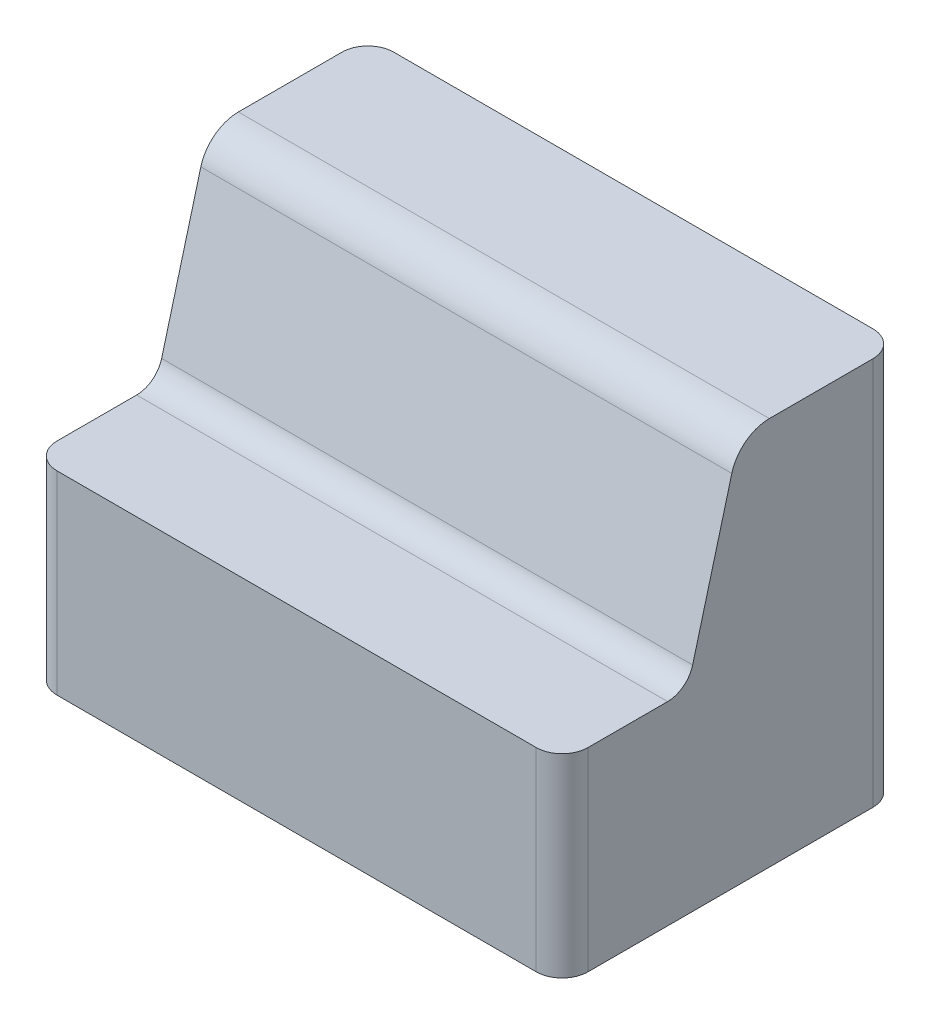
ISO-10303-21;
HEADER;
FILE_DESCRIPTION(('STEP AP214'),'2;1');
FILE_NAME('part.step','',(''),(''),'','','');
FILE_SCHEMA(('AUTOMOTIVE_DESIGN { 1 0 10303 214 1 1 1 1 }'));
ENDSEC;
DATA;
#1=APPLICATION_CONTEXT('core data for automotive mechanical design processes');
#2=APPLICATION_PROTOCOL_DEFINITION('international standard','automotive_design',2000,#1);
#3=PRODUCT_CONTEXT('',#1,'mechanical');
#4=PRODUCT('Part','Part','',(#3));
#5=PRODUCT_RELATED_PRODUCT_CATEGORY('part','',(#4));
#6=PRODUCT_DEFINITION_FORMATION('','',#4);
#7=PRODUCT_DEFINITION_CONTEXT('part definition',#1,'design');
#8=PRODUCT_DEFINITION('design','',#6,#7);
#9=PRODUCT_DEFINITION_SHAPE('','',#8);
#10=(LENGTH_UNIT() NAMED_UNIT(*) SI_UNIT(.MILLI.,.METRE.));
#11=(NAMED_UNIT(*) PLANE_ANGLE_UNIT() SI_UNIT($,.RADIAN.));
#12=(NAMED_UNIT(*) SI_UNIT($,.STERADIAN.) SOLID_ANGLE_UNIT());
#13=UNCERTAINTY_MEASURE_WITH_UNIT(LENGTH_MEASURE(1.E-05),#10,'distance_accuracy_value','');
#14=(GEOMETRIC_REPRESENTATION_CONTEXT(3) GLOBAL_UNCERTAINTY_ASSIGNED_CONTEXT((#13)) GLOBAL_UNIT_ASSIGNED_CONTEXT((#10,
#11,#12)) REPRESENTATION_CONTEXT('',''));
#15=CARTESIAN_POINT('',(0.,0.,0.));
#16=DIRECTION('',(0.,0.,1.));
#17=DIRECTION('',(1.,0.,0.));
#18=AXIS2_PLACEMENT_3D('',#15,#16,#17);
#19=CARTESIAN_POINT('',(20.5,-3.,10.));
#20=DIRECTION('',(-1.,0.,0.));
#21=DIRECTION('',(0.,0.,1.));
#22=AXIS2_PLACEMENT_3D('',#19,#20,#21);
#23=CYLINDRICAL_SURFACE('',#22,3.);
#24=CARTESIAN_POINT('',(-20.5,-3.,10.));
#25=DIRECTION('',(1.,0.,0.));
#26=DIRECTION('',(0.,0.,1.));
#27=AXIS2_PLACEMENT_3D('',#24,#25,#26);
#28=CIRCLE('',#27,3.);
#29=CARTESIAN_POINT('',(-20.5,0.,10.));
#30=VERTEX_POINT('',#29);
#31=CARTESIAN_POINT('',(-20.5,-2.22354286469243,12.8977774788672));
#32=VERTEX_POINT('',#31);
#33=EDGE_CURVE('E168',#30,#32,#28,.T.);
#34=ORIENTED_EDGE('',*,*,#33,.T.);
#35=DIRECTION('',(-1.,0.,0.));
#36=VECTOR('',#35,1.);
#37=CARTESIAN_POINT('',(20.5,-2.22354286469243,12.8977774788672));
#38=LINE('',#37,#36);
#39=CARTESIAN_POINT('',(20.5,-2.22354286469243,12.8977774788672));
#40=VERTEX_POINT('',#39);
#41=EDGE_CURVE('E207',#40,#32,#38,.T.);
#42=ORIENTED_EDGE('',*,*,#41,.F.);
#43=CARTESIAN_POINT('',(20.5,-3.,10.));
#44=DIRECTION('',(1.,0.,0.));
#45=DIRECTION('',(0.,0.,1.));
#46=AXIS2_PLACEMENT_3D('',#43,#44,#45);
#47=CIRCLE('',#46,3.);
#48=CARTESIAN_POINT('',(20.5,0.,10.));
#49=VERTEX_POINT('',#48);
#50=EDGE_CURVE('E169',#49,#40,#47,.T.);
#51=ORIENTED_EDGE('',*,*,#50,.F.);
#52=DIRECTION('',(-1.,0.,0.));
#53=VECTOR('',#52,1.);
#54=CARTESIAN_POINT('',(20.5,0.,10.));
#55=LINE('',#54,#53);
#56=EDGE_CURVE('E182',#49,#30,#55,.T.);
#57=ORIENTED_EDGE('',*,*,#56,.T.);
#58=EDGE_LOOP('',(#34,#42,#51,#57));
#59=FACE_BOUND('',#58,.T.);
#60=ADVANCED_FACE('F51',(#59),#23,.T.);
#61=CARTESIAN_POINT('',(20.5,-15.,16.3212188504038));
#62=DIRECTION('',(0.,-0.258819045102525,-0.965925826289067));
#63=DIRECTION('',(0.,0.965925826289067,-0.258819045102525));
#64=AXIS2_PLACEMENT_3D('',#61,#62,#63);
#65=PLANE('',#64);
#66=DIRECTION('',(0.,-0.965925826289067,0.258819045102525));
#67=VECTOR('',#66,1.);
#68=CARTESIAN_POINT('',(-20.5,-15.,16.3212188504038));
#69=LINE('',#68,#67);
#70=CARTESIAN_POINT('',(-20.5,-13.5176380902051,15.9240211737836));
#71=VERTEX_POINT('',#70);
#72=EDGE_CURVE('E185',#32,#71,#69,.T.);
#73=ORIENTED_EDGE('',*,*,#72,.T.);
#74=DIRECTION('',(-1.,0.,0.));
#75=VECTOR('',#74,1.);
#76=CARTESIAN_POINT('',(20.5,-13.5176380902051,15.9240211737836));
#77=LINE('',#76,#75);
#78=CARTESIAN_POINT('',(20.5,-13.5176380902051,15.9240211737836));
#79=VERTEX_POINT('',#78);
#80=EDGE_CURVE('E66',#71,#79,#77,.F.);
#81=ORIENTED_EDGE('',*,*,#80,.T.);
#82=DIRECTION('',(0.,-0.965925826289067,0.258819045102525));
#83=VECTOR('',#82,1.);
#84=CARTESIAN_POINT('',(20.5,-15.,16.3212188504038));
#85=LINE('',#84,#83);
#86=EDGE_CURVE('E172',#40,#79,#85,.T.);
#87=ORIENTED_EDGE('',*,*,#86,.F.);
#88=ORIENTED_EDGE('',*,*,#41,.T.);
#89=EDGE_LOOP('',(#73,#81,#87,#88));
#90=FACE_BOUND('',#89,.T.);
#91=ADVANCED_FACE('F303',(#90),#65,.F.);
#92=CARTESIAN_POINT('',(20.5,-15.,26.));
#93=DIRECTION('',(0.,-1.,0.));
#94=DIRECTION('',(0.,0.,-1.));
#95=AXIS2_PLACEMENT_3D('',#92,#93,#94);
#96=PLANE('',#95);
#97=DIRECTION('',(0.,0.,1.));
#98=VECTOR('',#97,1.);
#99=CARTESIAN_POINT('',(20.5,-15.,26.));
#100=LINE('',#99,#98);
#101=CARTESIAN_POINT('',(20.5,-15.,17.8558728263617));
#102=VERTEX_POINT('',#101);
#103=CARTESIAN_POINT('',(20.5,-15.,24.));
#104=VERTEX_POINT('',#103);
#105=EDGE_CURVE('E175',#102,#104,#100,.T.);
#106=ORIENTED_EDGE('',*,*,#105,.F.);
#107=DIRECTION('',(-1.,0.,0.));
#108=VECTOR('',#107,1.);
#109=CARTESIAN_POINT('',(-20.5,-15.,17.8558728263617));
#110=LINE('',#109,#108);
#111=CARTESIAN_POINT('',(-20.5,-15.,17.8558728263617));
#112=VERTEX_POINT('',#111);
#113=EDGE_CURVE('E248',#102,#112,#110,.T.);
#114=ORIENTED_EDGE('',*,*,#113,.T.);
#115=DIRECTION('',(0.,0.,1.));
#116=VECTOR('',#115,1.);
#117=CARTESIAN_POINT('',(-20.5,-15.,26.));
#118=LINE('',#117,#116);
#119=CARTESIAN_POINT('',(-20.5,-15.,24.));
#120=VERTEX_POINT('',#119);
#121=EDGE_CURVE('E187',#112,#120,#118,.T.);
#122=ORIENTED_EDGE('',*,*,#121,.T.);
#123=CARTESIAN_POINT('',(-18.5,-15.,24.));
#124=DIRECTION('',(0.,-1.,0.));
#125=DIRECTION('',(0.,0.,-1.));
#126=AXIS2_PLACEMENT_3D('',#123,#124,#125);
#127=CIRCLE('',#126,2.);
#128=CARTESIAN_POINT('',(-18.5,-15.,26.));
#129=VERTEX_POINT('',#128);
#130=EDGE_CURVE('E240',#120,#129,#127,.F.);
#131=ORIENTED_EDGE('',*,*,#130,.T.);
#132=DIRECTION('',(-1.,0.,0.));
#133=VECTOR('',#132,1.);
#134=CARTESIAN_POINT('',(20.5,-15.,26.));
#135=LINE('',#134,#133);
#136=CARTESIAN_POINT('',(18.5,-15.,26.));
#137=VERTEX_POINT('',#136);
#138=EDGE_CURVE('E204',#137,#129,#135,.T.);
#139=ORIENTED_EDGE('',*,*,#138,.F.);
#140=CARTESIAN_POINT('',(18.5,-15.,24.));
#141=DIRECTION('',(0.,-1.,0.));
#142=DIRECTION('',(0.,0.,-1.));
#143=AXIS2_PLACEMENT_3D('',#140,#141,#142);
#144=CIRCLE('',#143,2.);
#145=EDGE_CURVE('E237',#137,#104,#144,.F.);
#146=ORIENTED_EDGE('',*,*,#145,.T.);
#147=EDGE_LOOP('',(#106,#114,#122,#131,#139,#146));
#148=FACE_BOUND('',#147,.T.);
#149=ADVANCED_FACE('F254',(#148),#96,.F.);
#150=CARTESIAN_POINT('',(20.5,-30.,26.));
#151=DIRECTION('',(0.,0.,-1.));
#152=DIRECTION('',(-1.,0.,0.));
#153=AXIS2_PLACEMENT_3D('',#150,#151,#152);
#154=PLANE('',#153);
#155=ORIENTED_EDGE('',*,*,#138,.T.);
#156=DIRECTION('',(0.,-1.,0.));
#157=VECTOR('',#156,1.);
#158=CARTESIAN_POINT('',(-18.5,-30.,26.));
#159=LINE('',#158,#157);
#160=CARTESIAN_POINT('',(-18.5,-30.,26.));
#161=VERTEX_POINT('',#160);
#162=EDGE_CURVE('E234',#129,#161,#159,.T.);
#163=ORIENTED_EDGE('',*,*,#162,.T.);
#164=DIRECTION('',(-1.,0.,0.));
#165=VECTOR('',#164,1.);
#166=CARTESIAN_POINT('',(20.5,-30.,26.));
#167=LINE('',#166,#165);
#168=CARTESIAN_POINT('',(18.5,-30.,26.));
#169=VERTEX_POINT('',#168);
#170=EDGE_CURVE('E201',#169,#161,#167,.T.);
#171=ORIENTED_EDGE('',*,*,#170,.F.);
#172=DIRECTION('',(0.,-1.,0.));
#173=VECTOR('',#172,1.);
#174=CARTESIAN_POINT('',(18.5,-30.,26.));
#175=LINE('',#174,#173);
#176=EDGE_CURVE('E232',#169,#137,#175,.F.);
#177=ORIENTED_EDGE('',*,*,#176,.T.);
#178=EDGE_LOOP('',(#155,#163,#171,#177));
#179=FACE_BOUND('',#178,.T.);
#180=ADVANCED_FACE('F268',(#179),#154,.F.);
#181=CARTESIAN_POINT('',(20.5,-30.,0.));
#182=DIRECTION('',(0.,1.,0.));
#183=DIRECTION('',(0.,0.,1.));
#184=AXIS2_PLACEMENT_3D('',#181,#182,#183);
#185=PLANE('',#184);
#186=CARTESIAN_POINT('',(13.,-30.,7.5));
#187=DIRECTION('',(0.,-1.,0.));
#188=DIRECTION('',(0.,0.,-1.));
#189=AXIS2_PLACEMENT_3D('',#186,#187,#188);
#190=CIRCLE('',#189,3.025);
#191=CARTESIAN_POINT('',(13.,-30.,4.475));
#192=VERTEX_POINT('',#191);
#193=EDGE_CURVE('E159',#192,#192,#190,.T.);
#194=ORIENTED_EDGE('',*,*,#193,.F.);
#195=EDGE_LOOP('',(#194));
#196=FACE_BOUND('',#195,.T.);
#197=CARTESIAN_POINT('',(-13.,-30.,7.5));
#198=DIRECTION('',(0.,-1.,0.));
#199=DIRECTION('',(0.,0.,-1.));
#200=AXIS2_PLACEMENT_3D('',#197,#198,#199);
#201=CIRCLE('',#200,3.025);
#202=CARTESIAN_POINT('',(-13.,-30.,4.475));
#203=VERTEX_POINT('',#202);
#204=EDGE_CURVE('E152',#203,#203,#201,.T.);
#205=ORIENTED_EDGE('',*,*,#204,.F.);
#206=EDGE_LOOP('',(#205));
#207=FACE_BOUND('',#206,.T.);
#208=DIRECTION('',(0.,0.,-1.));
#209=VECTOR('',#208,1.);
#210=CARTESIAN_POINT('',(-20.5,-30.,0.));
#211=LINE('',#210,#209);
#212=CARTESIAN_POINT('',(-20.5,-30.,24.));
#213=VERTEX_POINT('',#212);
#214=CARTESIAN_POINT('',(-20.5,-30.,2.));
#215=VERTEX_POINT('',#214);
#216=EDGE_CURVE('E189',#213,#215,#211,.T.);
#217=ORIENTED_EDGE('',*,*,#216,.T.);
#218=CARTESIAN_POINT('',(-18.5,-30.,2.));
#219=DIRECTION('',(0.,1.,0.));
#220=DIRECTION('',(0.,0.,1.));
#221=AXIS2_PLACEMENT_3D('',#218,#219,#220);
#222=CIRCLE('',#221,2.);
#223=CARTESIAN_POINT('',(-18.5,-30.,0.));
#224=VERTEX_POINT('',#223);
#225=EDGE_CURVE('E230',#215,#224,#222,.F.);
#226=ORIENTED_EDGE('',*,*,#225,.T.);
#227=DIRECTION('',(-1.,0.,0.));
#228=VECTOR('',#227,1.);
#229=CARTESIAN_POINT('',(20.5,-30.,0.));
#230=LINE('',#229,#228);
#231=CARTESIAN_POINT('',(18.5,-30.,0.));
#232=VERTEX_POINT('',#231);
#233=EDGE_CURVE('E198',#232,#224,#230,.T.);
#234=ORIENTED_EDGE('',*,*,#233,.F.);
#235=CARTESIAN_POINT('',(18.5,-30.,2.));
#236=DIRECTION('',(0.,1.,0.));
#237=DIRECTION('',(0.,0.,1.));
#238=AXIS2_PLACEMENT_3D('',#235,#236,#237);
#239=CIRCLE('',#238,2.);
#240=CARTESIAN_POINT('',(20.5,-30.,2.));
#241=VERTEX_POINT('',#240);
#242=EDGE_CURVE('E226',#232,#241,#239,.F.);
#243=ORIENTED_EDGE('',*,*,#242,.T.);
#244=DIRECTION('',(0.,0.,-1.));
#245=VECTOR('',#244,1.);
#246=CARTESIAN_POINT('',(20.5,-30.,0.));
#247=LINE('',#246,#245);
#248=CARTESIAN_POINT('',(20.5,-30.,24.));
#249=VERTEX_POINT('',#248);
#250=EDGE_CURVE('E177',#249,#241,#247,.T.);
#251=ORIENTED_EDGE('',*,*,#250,.F.);
#252=CARTESIAN_POINT('',(18.5,-30.,24.));
#253=DIRECTION('',(0.,1.,0.));
#254=DIRECTION('',(0.,0.,1.));
#255=AXIS2_PLACEMENT_3D('',#252,#253,#254);
#256=CIRCLE('',#255,2.);
#257=EDGE_CURVE('E224',#249,#169,#256,.F.);
#258=ORIENTED_EDGE('',*,*,#257,.T.);
#259=ORIENTED_EDGE('',*,*,#170,.T.);
#260=CARTESIAN_POINT('',(-18.5,-30.,24.));
#261=DIRECTION('',(0.,1.,0.));
#262=DIRECTION('',(0.,0.,1.));
#263=AXIS2_PLACEMENT_3D('',#260,#261,#262);
#264=CIRCLE('',#263,2.);
#265=EDGE_CURVE('E228',#161,#213,#264,.F.);
#266=ORIENTED_EDGE('',*,*,#265,.T.);
#267=EDGE_LOOP('',(#217,#226,#234,#243,#251,#258,#259,#266));
#268=FACE_BOUND('',#267,.T.);
#269=ADVANCED_FACE('F279',(#196,#207,#268),#185,.F.);
#270=CARTESIAN_POINT('',(20.5,0.,0.));
#271=DIRECTION('',(0.,0.,1.));
#272=DIRECTION('',(0.,-1.,0.));
#273=AXIS2_PLACEMENT_3D('',#270,#271,#272);
#274=PLANE('',#273);
#275=ORIENTED_EDGE('',*,*,#233,.T.);
#276=DIRECTION('',(0.,1.,0.));
#277=VECTOR('',#276,1.);
#278=CARTESIAN_POINT('',(-18.5,0.,0.));
#279=LINE('',#278,#277);
#280=CARTESIAN_POINT('',(-18.5,0.,0.));
#281=VERTEX_POINT('',#280);
#282=EDGE_CURVE('E212',#224,#281,#279,.T.);
#283=ORIENTED_EDGE('',*,*,#282,.T.);
#284=DIRECTION('',(-1.,0.,0.));
#285=VECTOR('',#284,1.);
#286=CARTESIAN_POINT('',(20.5,0.,0.));
#287=LINE('',#286,#285);
#288=CARTESIAN_POINT('',(18.5,0.,0.));
#289=VERTEX_POINT('',#288);
#290=EDGE_CURVE('E195',#289,#281,#287,.T.);
#291=ORIENTED_EDGE('',*,*,#290,.F.);
#292=DIRECTION('',(0.,1.,0.));
#293=VECTOR('',#292,1.);
#294=CARTESIAN_POINT('',(18.5,0.,0.));
#295=LINE('',#294,#293);
#296=EDGE_CURVE('E210',#289,#232,#295,.F.);
#297=ORIENTED_EDGE('',*,*,#296,.T.);
#298=EDGE_LOOP('',(#275,#283,#291,#297));
#299=FACE_BOUND('',#298,.T.);
#300=ADVANCED_FACE('F342',(#299),#274,.F.);
#301=CARTESIAN_POINT('',(20.5,0.,10.));
#302=DIRECTION('',(0.,-1.,0.));
#303=DIRECTION('',(0.,0.,-1.));
#304=AXIS2_PLACEMENT_3D('',#301,#302,#303);
#305=PLANE('',#304);
#306=ORIENTED_EDGE('',*,*,#290,.T.);
#307=CARTESIAN_POINT('',(-18.5,0.,2.));
#308=DIRECTION('',(0.,-1.,0.));
#309=DIRECTION('',(0.,0.,-1.));
#310=AXIS2_PLACEMENT_3D('',#307,#308,#309);
#311=CIRCLE('',#310,2.);
#312=CARTESIAN_POINT('',(-20.5,0.,2.));
#313=VERTEX_POINT('',#312);
#314=EDGE_CURVE('E217',#281,#313,#311,.F.);
#315=ORIENTED_EDGE('',*,*,#314,.T.);
#316=DIRECTION('',(0.,0.,1.));
#317=VECTOR('',#316,1.);
#318=CARTESIAN_POINT('',(-20.5,0.,10.));
#319=LINE('',#318,#317);
#320=EDGE_CURVE('E173',#313,#30,#319,.T.);
#321=ORIENTED_EDGE('',*,*,#320,.T.);
#322=ORIENTED_EDGE('',*,*,#56,.F.);
#323=DIRECTION('',(0.,0.,1.));
#324=VECTOR('',#323,1.);
#325=CARTESIAN_POINT('',(20.5,0.,10.));
#326=LINE('',#325,#324);
#327=CARTESIAN_POINT('',(20.5,0.,2.));
#328=VERTEX_POINT('',#327);
#329=EDGE_CURVE('E180',#328,#49,#326,.T.);
#330=ORIENTED_EDGE('',*,*,#329,.F.);
#331=CARTESIAN_POINT('',(18.5,0.,2.));
#332=DIRECTION('',(0.,-1.,0.));
#333=DIRECTION('',(0.,0.,-1.));
#334=AXIS2_PLACEMENT_3D('',#331,#332,#333);
#335=CIRCLE('',#334,2.);
#336=EDGE_CURVE('E215',#328,#289,#335,.F.);
#337=ORIENTED_EDGE('',*,*,#336,.T.);
#338=EDGE_LOOP('',(#306,#315,#321,#322,#330,#337));
#339=FACE_BOUND('',#338,.T.);
#340=ADVANCED_FACE('F288',(#339),#305,.F.);
#341=CARTESIAN_POINT('',(20.5,-3.,10.));
#342=DIRECTION('',(-1.,0.,0.));
#343=DIRECTION('',(0.,0.,1.));
#344=AXIS2_PLACEMENT_3D('',#341,#342,#343);
#345=PLANE('',#344);
#346=ORIENTED_EDGE('',*,*,#250,.T.);
#347=DIRECTION('',(0.,1.,0.));
#348=VECTOR('',#347,1.);
#349=CARTESIAN_POINT('',(20.5,-3.,2.));
#350=LINE('',#349,#348);
#351=EDGE_CURVE('E245',#241,#328,#350,.T.);
#352=ORIENTED_EDGE('',*,*,#351,.T.);
#353=ORIENTED_EDGE('',*,*,#329,.T.);
#354=ORIENTED_EDGE('',*,*,#50,.T.);
#355=ORIENTED_EDGE('',*,*,#86,.T.);
#356=CARTESIAN_POINT('',(20.5,-13.,17.8558728263617));
#357=DIRECTION('',(-1.,0.,0.));
#358=DIRECTION('',(0.,0.,1.));
#359=AXIS2_PLACEMENT_3D('',#356,#357,#358);
#360=CIRCLE('',#359,2.);
#361=EDGE_CURVE('E11',#79,#102,#360,.T.);
#362=ORIENTED_EDGE('',*,*,#361,.T.);
#363=ORIENTED_EDGE('',*,*,#105,.T.);
#364=DIRECTION('',(0.,-1.,0.));
#365=VECTOR('',#364,1.);
#366=CARTESIAN_POINT('',(20.5,-3.,24.));
#367=LINE('',#366,#365);
#368=EDGE_CURVE('E242',#104,#249,#367,.T.);
#369=ORIENTED_EDGE('',*,*,#368,.T.);
#370=EDGE_LOOP('',(#346,#352,#353,#354,#355,#362,#363,#369));
#371=FACE_BOUND('',#370,.T.);
#372=ADVANCED_FACE('F276',(#371),#345,.F.);
#373=CARTESIAN_POINT('',(-20.5,-3.,10.));
#374=DIRECTION('',(-1.,0.,0.));
#375=DIRECTION('',(0.,0.,1.));
#376=AXIS2_PLACEMENT_3D('',#373,#374,#375);
#377=PLANE('',#376);
#378=ORIENTED_EDGE('',*,*,#320,.F.);
#379=DIRECTION('',(0.,1.,0.));
#380=VECTOR('',#379,1.);
#381=CARTESIAN_POINT('',(-20.5,-30.,2.));
#382=LINE('',#381,#380);
#383=EDGE_CURVE('E222',#313,#215,#382,.F.);
#384=ORIENTED_EDGE('',*,*,#383,.T.);
#385=ORIENTED_EDGE('',*,*,#216,.F.);
#386=DIRECTION('',(0.,-1.,0.));
#387=VECTOR('',#386,1.);
#388=CARTESIAN_POINT('',(-20.5,-15.,24.));
#389=LINE('',#388,#387);
#390=EDGE_CURVE('E219',#213,#120,#389,.F.);
#391=ORIENTED_EDGE('',*,*,#390,.T.);
#392=ORIENTED_EDGE('',*,*,#121,.F.);
#393=CARTESIAN_POINT('',(-20.5,-13.,17.8558728263617));
#394=DIRECTION('',(-1.,0.,0.));
#395=DIRECTION('',(0.,0.,1.));
#396=AXIS2_PLACEMENT_3D('',#393,#394,#395);
#397=CIRCLE('',#396,2.);
#398=EDGE_CURVE('E59',#112,#71,#397,.F.);
#399=ORIENTED_EDGE('',*,*,#398,.T.);
#400=ORIENTED_EDGE('',*,*,#72,.F.);
#401=ORIENTED_EDGE('',*,*,#33,.F.);
#402=EDGE_LOOP('',(#378,#384,#385,#391,#392,#399,#400,#401));
#403=FACE_BOUND('',#402,.T.);
#404=ADVANCED_FACE('F258',(#403),#377,.T.);
#405=CARTESIAN_POINT('',(-18.5,0.,2.));
#406=DIRECTION('',(0.,-1.,0.));
#407=DIRECTION('',(0.,0.,-1.));
#408=AXIS2_PLACEMENT_3D('',#405,#406,#407);
#409=CYLINDRICAL_SURFACE('',#408,2.);
#410=ORIENTED_EDGE('',*,*,#225,.F.);
#411=ORIENTED_EDGE('',*,*,#383,.F.);
#412=ORIENTED_EDGE('',*,*,#314,.F.);
#413=ORIENTED_EDGE('',*,*,#282,.F.);
#414=EDGE_LOOP('',(#410,#411,#412,#413));
#415=FACE_BOUND('',#414,.T.);
#416=ADVANCED_FACE('F312',(#415),#409,.T.);
#417=CARTESIAN_POINT('',(-18.5,-30.,24.));
#418=DIRECTION('',(0.,1.,0.));
#419=DIRECTION('',(0.,0.,1.));
#420=AXIS2_PLACEMENT_3D('',#417,#418,#419);
#421=CYLINDRICAL_SURFACE('',#420,2.);
#422=ORIENTED_EDGE('',*,*,#130,.F.);
#423=ORIENTED_EDGE('',*,*,#390,.F.);
#424=ORIENTED_EDGE('',*,*,#265,.F.);
#425=ORIENTED_EDGE('',*,*,#162,.F.);
#426=EDGE_LOOP('',(#422,#423,#424,#425));
#427=FACE_BOUND('',#426,.T.);
#428=ADVANCED_FACE('F264',(#427),#421,.T.);
#429=CARTESIAN_POINT('',(18.5,-3.,2.));
#430=DIRECTION('',(0.,1.,0.));
#431=DIRECTION('',(0.,0.,1.));
#432=AXIS2_PLACEMENT_3D('',#429,#430,#431);
#433=CYLINDRICAL_SURFACE('',#432,2.);
#434=ORIENTED_EDGE('',*,*,#242,.F.);
#435=ORIENTED_EDGE('',*,*,#296,.F.);
#436=ORIENTED_EDGE('',*,*,#336,.F.);
#437=ORIENTED_EDGE('',*,*,#351,.F.);
#438=EDGE_LOOP('',(#434,#435,#436,#437));
#439=FACE_BOUND('',#438,.T.);
#440=ADVANCED_FACE('F284',(#439),#433,.T.);
#441=CARTESIAN_POINT('',(18.5,-3.,24.));
#442=DIRECTION('',(0.,-1.,0.));
#443=DIRECTION('',(0.,0.,-1.));
#444=AXIS2_PLACEMENT_3D('',#441,#442,#443);
#445=CYLINDRICAL_SURFACE('',#444,2.);
#446=ORIENTED_EDGE('',*,*,#145,.F.);
#447=ORIENTED_EDGE('',*,*,#176,.F.);
#448=ORIENTED_EDGE('',*,*,#257,.F.);
#449=ORIENTED_EDGE('',*,*,#368,.F.);
#450=EDGE_LOOP('',(#446,#447,#448,#449));
#451=FACE_BOUND('',#450,.T.);
#452=ADVANCED_FACE('F272',(#451),#445,.T.);
#453=CARTESIAN_POINT('',(-13.,-13.,7.5));
#454=DIRECTION('',(0.,-1.,0.));
#455=DIRECTION('',(0.,0.,-1.));
#456=AXIS2_PLACEMENT_3D('',#453,#454,#455);
#457=CONICAL_SURFACE('',#456,2.49999999999999,1.02974425867665);
#458=CARTESIAN_POINT('',(-13.,-11.4978484524311,7.5));
#459=VERTEX_POINT('',#458);
#460=VERTEX_LOOP('',#459);
#461=FACE_BOUND('',#460,.T.);
#462=CARTESIAN_POINT('',(-13.,-13.,7.5));
#463=DIRECTION('',(0.,-1.,0.));
#464=DIRECTION('',(0.,0.,-1.));
#465=AXIS2_PLACEMENT_3D('',#462,#463,#464);
#466=CIRCLE('',#465,2.49999999999999);
#467=CARTESIAN_POINT('',(-13.,-13.,5.00000000000001));
#468=VERTEX_POINT('',#467);
#469=EDGE_CURVE('E165',#468,#468,#466,.T.);
#470=ORIENTED_EDGE('',*,*,#469,.T.);
#471=EDGE_LOOP('',(#470));
#472=FACE_BOUND('',#471,.T.);
#473=ADVANCED_FACE('F320',(#461,#472),#457,.F.);
#474=CARTESIAN_POINT('',(-13.,-30.,7.5));
#475=DIRECTION('',(0.,-1.,0.));
#476=DIRECTION('',(0.,0.,-1.));
#477=AXIS2_PLACEMENT_3D('',#474,#475,#476);
#478=CYLINDRICAL_SURFACE('',#477,2.49999999999999);
#479=ORIENTED_EDGE('',*,*,#469,.F.);
#480=EDGE_LOOP('',(#479));
#481=FACE_BOUND('',#480,.T.);
#482=CARTESIAN_POINT('',(-13.,-29.475,7.5));
#483=DIRECTION('',(0.,-1.,0.));
#484=DIRECTION('',(0.,0.,-1.));
#485=AXIS2_PLACEMENT_3D('',#482,#483,#484);
#486=CIRCLE('',#485,2.49999999999999);
#487=CARTESIAN_POINT('',(-13.,-29.475,5.00000000000001));
#488=VERTEX_POINT('',#487);
#489=EDGE_CURVE('E156',#488,#488,#486,.T.);
#490=ORIENTED_EDGE('',*,*,#489,.T.);
#491=EDGE_LOOP('',(#490));
#492=FACE_BOUND('',#491,.T.);
#493=ADVANCED_FACE('F325',(#481,#492),#478,.F.);
#494=CARTESIAN_POINT('',(-13.,-30.,7.5));
#495=DIRECTION('',(0.,-1.,0.));
#496=DIRECTION('',(0.,0.,-1.));
#497=AXIS2_PLACEMENT_3D('',#494,#495,#496);
#498=CONICAL_SURFACE('',#497,3.025,0.785398163397443);
#499=ORIENTED_EDGE('',*,*,#489,.F.);
#500=EDGE_LOOP('',(#499));
#501=FACE_BOUND('',#500,.T.);
#502=ORIENTED_EDGE('',*,*,#204,.T.);
#503=EDGE_LOOP('',(#502));
#504=FACE_BOUND('',#503,.T.);
#505=ADVANCED_FACE('F146',(#501,#504),#498,.F.);
#506=CARTESIAN_POINT('',(13.,-13.,7.5));
#507=DIRECTION('',(0.,-1.,0.));
#508=DIRECTION('',(0.,0.,-1.));
#509=AXIS2_PLACEMENT_3D('',#506,#507,#508);
#510=CONICAL_SURFACE('',#509,2.49999999999999,1.02974425867665);
#511=CARTESIAN_POINT('',(13.,-11.4978484524311,7.5));
#512=VERTEX_POINT('',#511);
#513=VERTEX_LOOP('',#512);
#514=FACE_BOUND('',#513,.T.);
#515=CARTESIAN_POINT('',(13.,-13.,7.5));
#516=DIRECTION('',(0.,-1.,0.));
#517=DIRECTION('',(0.,0.,-1.));
#518=AXIS2_PLACEMENT_3D('',#515,#516,#517);
#519=CIRCLE('',#518,2.49999999999999);
#520=CARTESIAN_POINT('',(13.,-13.,5.00000000000001));
#521=VERTEX_POINT('',#520);
#522=EDGE_CURVE('E150',#521,#521,#519,.T.);
#523=ORIENTED_EDGE('',*,*,#522,.T.);
#524=EDGE_LOOP('',(#523));
#525=FACE_BOUND('',#524,.T.);
#526=ADVANCED_FACE('F142',(#514,#525),#510,.F.);
#527=CARTESIAN_POINT('',(13.,-30.,7.5));
#528=DIRECTION('',(0.,-1.,0.));
#529=DIRECTION('',(0.,0.,-1.));
#530=AXIS2_PLACEMENT_3D('',#527,#528,#529);
#531=CYLINDRICAL_SURFACE('',#530,2.49999999999999);
#532=ORIENTED_EDGE('',*,*,#522,.F.);
#533=EDGE_LOOP('',(#532));
#534=FACE_BOUND('',#533,.T.);
#535=CARTESIAN_POINT('',(13.,-29.475,7.5));
#536=DIRECTION('',(0.,-1.,0.));
#537=DIRECTION('',(0.,0.,-1.));
#538=AXIS2_PLACEMENT_3D('',#535,#536,#537);
#539=CIRCLE('',#538,2.49999999999999);
#540=CARTESIAN_POINT('',(13.,-29.475,5.00000000000001));
#541=VERTEX_POINT('',#540);
#542=EDGE_CURVE('E153',#541,#541,#539,.T.);
#543=ORIENTED_EDGE('',*,*,#542,.T.);
#544=EDGE_LOOP('',(#543));
#545=FACE_BOUND('',#544,.T.);
#546=ADVANCED_FACE('F145',(#534,#545),#531,.F.);
#547=CARTESIAN_POINT('',(13.,-30.,7.5));
#548=DIRECTION('',(0.,-1.,0.));
#549=DIRECTION('',(0.,0.,-1.));
#550=AXIS2_PLACEMENT_3D('',#547,#548,#549);
#551=CONICAL_SURFACE('',#550,3.025,0.785398163397443);
#552=ORIENTED_EDGE('',*,*,#542,.F.);
#553=EDGE_LOOP('',(#552));
#554=FACE_BOUND('',#553,.T.);
#555=ORIENTED_EDGE('',*,*,#193,.T.);
#556=EDGE_LOOP('',(#555));
#557=FACE_BOUND('',#556,.T.);
#558=ADVANCED_FACE('F295',(#554,#557),#551,.F.);
#559=CARTESIAN_POINT('',(20.5,-13.,17.8558728263617));
#560=DIRECTION('',(1.,0.,0.));
#561=DIRECTION('',(0.,0.,-1.));
#562=AXIS2_PLACEMENT_3D('',#559,#560,#561);
#563=CYLINDRICAL_SURFACE('',#562,2.);
#564=ORIENTED_EDGE('',*,*,#361,.F.);
#565=ORIENTED_EDGE('',*,*,#80,.F.);
#566=ORIENTED_EDGE('',*,*,#398,.F.);
#567=ORIENTED_EDGE('',*,*,#113,.F.);
#568=EDGE_LOOP('',(#564,#565,#566,#567));
#569=FACE_BOUND('',#568,.T.);
#570=ADVANCED_FACE('F53',(#569),#563,.F.);
#571=CLOSED_SHELL('',(#60,#91,#149,#180,#269,#300,#340,#372,#404,#416,#428,#440,#452,#473,#493,
#505,#526,#546,#558,#570));
#572=MANIFOLD_SOLID_BREP('B2',#571);
#573=ADVANCED_BREP_SHAPE_REPRESENTATION('',(#18,#572),#14);
#574=SHAPE_DEFINITION_REPRESENTATION(#9,#573);
ENDSEC;
END-ISO-10303-21;
